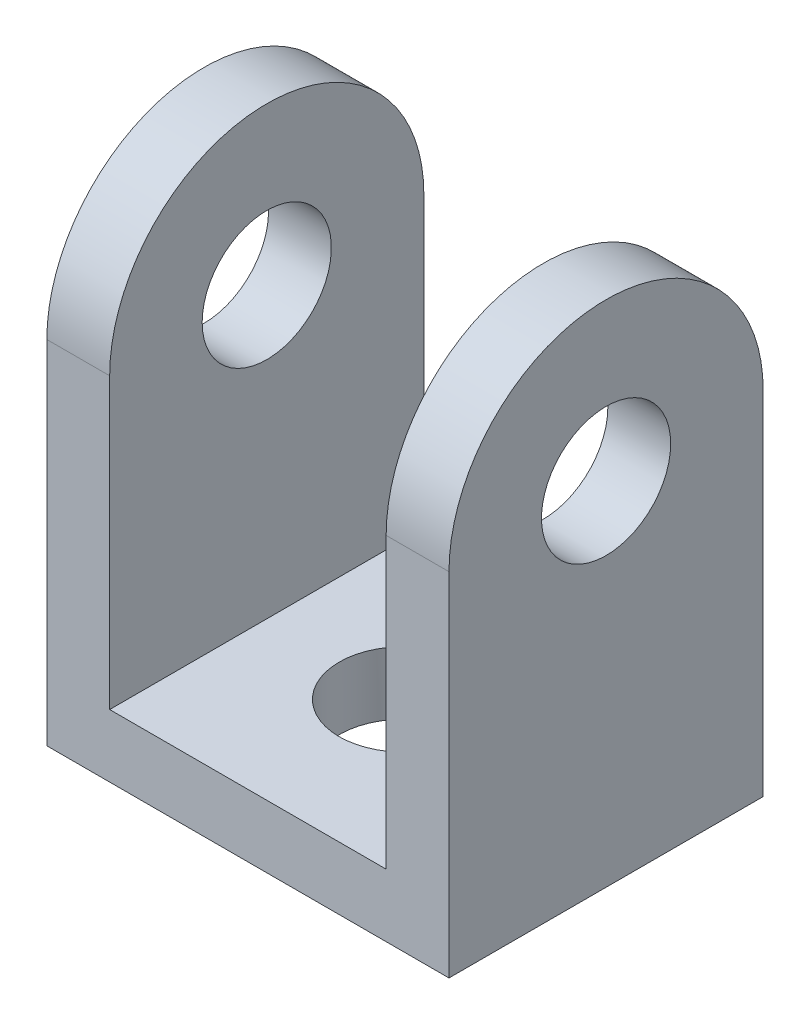
ISO-10303-21;
HEADER;
FILE_DESCRIPTION(('STEP AP214'),'2;1');
FILE_NAME('part.step','',(''),(''),'','','');
FILE_SCHEMA(('AUTOMOTIVE_DESIGN { 1 0 10303 214 1 1 1 1 }'));
ENDSEC;
DATA;
#1=APPLICATION_CONTEXT('core data for automotive mechanical design processes');
#2=APPLICATION_PROTOCOL_DEFINITION('international standard','automotive_design',2000,#1);
#3=PRODUCT_CONTEXT('',#1,'mechanical');
#4=PRODUCT('Part','Part','',(#3));
#5=PRODUCT_RELATED_PRODUCT_CATEGORY('part','',(#4));
#6=PRODUCT_DEFINITION_FORMATION('','',#4);
#7=PRODUCT_DEFINITION_CONTEXT('part definition',#1,'design');
#8=PRODUCT_DEFINITION('design','',#6,#7);
#9=PRODUCT_DEFINITION_SHAPE('','',#8);
#10=(LENGTH_UNIT() NAMED_UNIT(*) SI_UNIT(.MILLI.,.METRE.));
#11=(NAMED_UNIT(*) PLANE_ANGLE_UNIT() SI_UNIT($,.RADIAN.));
#12=(NAMED_UNIT(*) SI_UNIT($,.STERADIAN.) SOLID_ANGLE_UNIT());
#13=UNCERTAINTY_MEASURE_WITH_UNIT(LENGTH_MEASURE(1.E-05),#10,'distance_accuracy_value','');
#14=(GEOMETRIC_REPRESENTATION_CONTEXT(3) GLOBAL_UNCERTAINTY_ASSIGNED_CONTEXT((#13)) GLOBAL_UNIT_ASSIGNED_CONTEXT((#10,
#11,#12)) REPRESENTATION_CONTEXT('',''));
#15=CARTESIAN_POINT('',(0.,0.,0.));
#16=DIRECTION('',(0.,0.,1.));
#17=DIRECTION('',(1.,0.,0.));
#18=AXIS2_PLACEMENT_3D('',#15,#16,#17);
#19=CARTESIAN_POINT('',(20.32,0.,0.));
#20=DIRECTION('',(-1.,0.,0.));
#21=DIRECTION('',(0.,0.,1.));
#22=AXIS2_PLACEMENT_3D('',#19,#20,#21);
#23=CYLINDRICAL_SURFACE('',#22,7.9375);
#24=DIRECTION('',(-1.,0.,0.));
#25=VECTOR('',#24,1.);
#26=CARTESIAN_POINT('',(20.32,0.,-7.9375));
#27=LINE('',#26,#25);
#28=CARTESIAN_POINT('',(20.32,0.,-7.9375));
#29=VERTEX_POINT('',#28);
#30=CARTESIAN_POINT('',(17.145,0.,-7.9375));
#31=VERTEX_POINT('',#30);
#32=EDGE_CURVE('E52',#29,#31,#27,.T.);
#33=ORIENTED_EDGE('',*,*,#32,.T.);
#34=CARTESIAN_POINT('',(17.145,0.,0.));
#35=DIRECTION('',(1.,0.,0.));
#36=DIRECTION('',(0.,0.,-1.));
#37=AXIS2_PLACEMENT_3D('',#34,#35,#36);
#38=CIRCLE('',#37,7.9375);
#39=CARTESIAN_POINT('',(17.145,0.,7.9375));
#40=VERTEX_POINT('',#39);
#41=EDGE_CURVE('E149',#31,#40,#38,.T.);
#42=ORIENTED_EDGE('',*,*,#41,.T.);
#43=DIRECTION('',(-1.,0.,0.));
#44=VECTOR('',#43,1.);
#45=CARTESIAN_POINT('',(20.32,0.,7.9375));
#46=LINE('',#45,#44);
#47=CARTESIAN_POINT('',(20.32,0.,7.9375));
#48=VERTEX_POINT('',#47);
#49=EDGE_CURVE('E177',#48,#40,#46,.T.);
#50=ORIENTED_EDGE('',*,*,#49,.F.);
#51=CARTESIAN_POINT('',(20.32,0.,0.));
#52=DIRECTION('',(1.,0.,0.));
#53=DIRECTION('',(0.,0.,-1.));
#54=AXIS2_PLACEMENT_3D('',#51,#52,#53);
#55=CIRCLE('',#54,7.9375);
#56=EDGE_CURVE('E97',#29,#48,#55,.T.);
#57=ORIENTED_EDGE('',*,*,#56,.F.);
#58=EDGE_LOOP('',(#33,#42,#50,#57));
#59=FACE_BOUND('',#58,.T.);
#60=ADVANCED_FACE('F43',(#59),#23,.T.);
#61=CARTESIAN_POINT('',(20.32,0.,0.));
#62=DIRECTION('',(-1.,0.,0.));
#63=DIRECTION('',(0.,0.,1.));
#64=AXIS2_PLACEMENT_3D('',#61,#62,#63);
#65=CYLINDRICAL_SURFACE('',#64,3.2639);
#66=CARTESIAN_POINT('',(17.145,0.,0.));
#67=DIRECTION('',(1.,0.,0.));
#68=DIRECTION('',(0.,0.,-1.));
#69=AXIS2_PLACEMENT_3D('',#66,#67,#68);
#70=CIRCLE('',#69,3.2639);
#71=CARTESIAN_POINT('',(17.145,0.,-3.2639));
#72=VERTEX_POINT('',#71);
#73=EDGE_CURVE('E139',#72,#72,#70,.T.);
#74=ORIENTED_EDGE('',*,*,#73,.F.);
#75=EDGE_LOOP('',(#74));
#76=FACE_BOUND('',#75,.T.);
#77=CARTESIAN_POINT('',(20.32,0.,0.));
#78=DIRECTION('',(1.,0.,0.));
#79=DIRECTION('',(0.,0.,-1.));
#80=AXIS2_PLACEMENT_3D('',#77,#78,#79);
#81=CIRCLE('',#80,3.2639);
#82=CARTESIAN_POINT('',(20.32,0.,-3.2639));
#83=VERTEX_POINT('',#82);
#84=EDGE_CURVE('E160',#83,#83,#81,.T.);
#85=ORIENTED_EDGE('',*,*,#84,.T.);
#86=EDGE_LOOP('',(#85));
#87=FACE_BOUND('',#86,.T.);
#88=ADVANCED_FACE('F208',(#76,#87),#65,.F.);
#89=CARTESIAN_POINT('',(20.32,0.,-7.9375));
#90=DIRECTION('',(0.,0.,1.));
#91=DIRECTION('',(0.,-1.,0.));
#92=AXIS2_PLACEMENT_3D('',#89,#90,#91);
#93=PLANE('',#92);
#94=DIRECTION('',(1.,0.,0.));
#95=VECTOR('',#94,1.);
#96=CARTESIAN_POINT('',(20.32,-14.605,-7.9375));
#97=LINE('',#96,#95);
#98=CARTESIAN_POINT('',(3.175,-14.605,-7.9375));
#99=VERTEX_POINT('',#98);
#100=CARTESIAN_POINT('',(17.145,-14.605,-7.9375));
#101=VERTEX_POINT('',#100);
#102=EDGE_CURVE('E120',#99,#101,#97,.T.);
#103=ORIENTED_EDGE('',*,*,#102,.T.);
#104=DIRECTION('',(0.,1.,0.));
#105=VECTOR('',#104,1.);
#106=CARTESIAN_POINT('',(17.145,0.,-7.9375));
#107=LINE('',#106,#105);
#108=EDGE_CURVE('E130',#101,#31,#107,.T.);
#109=ORIENTED_EDGE('',*,*,#108,.T.);
#110=ORIENTED_EDGE('',*,*,#32,.F.);
#111=DIRECTION('',(0.,1.,0.));
#112=VECTOR('',#111,1.);
#113=CARTESIAN_POINT('',(20.32,0.,-7.9375));
#114=LINE('',#113,#112);
#115=CARTESIAN_POINT('',(20.32,-17.78,-7.9375));
#116=VERTEX_POINT('',#115);
#117=EDGE_CURVE('E153',#116,#29,#114,.T.);
#118=ORIENTED_EDGE('',*,*,#117,.F.);
#119=DIRECTION('',(-1.,0.,0.));
#120=VECTOR('',#119,1.);
#121=CARTESIAN_POINT('',(20.32,-17.78,-7.9375));
#122=LINE('',#121,#120);
#123=CARTESIAN_POINT('',(0.,-17.78,-7.9375));
#124=VERTEX_POINT('',#123);
#125=EDGE_CURVE('E163',#116,#124,#122,.T.);
#126=ORIENTED_EDGE('',*,*,#125,.T.);
#127=DIRECTION('',(0.,1.,0.));
#128=VECTOR('',#127,1.);
#129=CARTESIAN_POINT('',(0.,0.,-7.9375));
#130=LINE('',#129,#128);
#131=CARTESIAN_POINT('',(0.,0.,-7.9375));
#132=VERTEX_POINT('',#131);
#133=EDGE_CURVE('E129',#124,#132,#130,.T.);
#134=ORIENTED_EDGE('',*,*,#133,.T.);
#135=CARTESIAN_POINT('',(3.175,0.,-7.9375));
#136=VERTEX_POINT('',#135);
#137=EDGE_CURVE('E138',#136,#132,#27,.T.);
#138=ORIENTED_EDGE('',*,*,#137,.F.);
#139=DIRECTION('',(0.,-1.,0.));
#140=VECTOR('',#139,1.);
#141=CARTESIAN_POINT('',(3.175,0.,-7.9375));
#142=LINE('',#141,#140);
#143=EDGE_CURVE('E133',#136,#99,#142,.T.);
#144=ORIENTED_EDGE('',*,*,#143,.T.);
#145=EDGE_LOOP('',(#103,#109,#110,#118,#126,#134,#138,#144));
#146=FACE_BOUND('',#145,.T.);
#147=ADVANCED_FACE('F45',(#146),#93,.F.);
#148=CARTESIAN_POINT('',(3.175,0.,7.9375));
#149=VERTEX_POINT('',#148);
#150=CARTESIAN_POINT('',(0.,0.,7.9375));
#151=VERTEX_POINT('',#150);
#152=EDGE_CURVE('E176',#149,#151,#46,.T.);
#153=ORIENTED_EDGE('',*,*,#152,.F.);
#154=CARTESIAN_POINT('',(3.175,0.,0.));
#155=DIRECTION('',(-1.,0.,0.));
#156=DIRECTION('',(0.,0.,1.));
#157=AXIS2_PLACEMENT_3D('',#154,#155,#156);
#158=CIRCLE('',#157,7.9375);
#159=EDGE_CURVE('E59',#149,#136,#158,.T.);
#160=ORIENTED_EDGE('',*,*,#159,.T.);
#161=ORIENTED_EDGE('',*,*,#137,.T.);
#162=CARTESIAN_POINT('',(0.,0.,0.));
#163=DIRECTION('',(1.,0.,0.));
#164=DIRECTION('',(0.,0.,-1.));
#165=AXIS2_PLACEMENT_3D('',#162,#163,#164);
#166=CIRCLE('',#165,7.9375);
#167=EDGE_CURVE('E165',#132,#151,#166,.T.);
#168=ORIENTED_EDGE('',*,*,#167,.T.);
#169=EDGE_LOOP('',(#153,#160,#161,#168));
#170=FACE_BOUND('',#169,.T.);
#171=ADVANCED_FACE('F209',(#170),#23,.T.);
#172=CARTESIAN_POINT('',(20.32,0.,7.9375));
#173=DIRECTION('',(0.,0.,-1.));
#174=DIRECTION('',(0.,1.,0.));
#175=AXIS2_PLACEMENT_3D('',#172,#173,#174);
#176=PLANE('',#175);
#177=ORIENTED_EDGE('',*,*,#49,.T.);
#178=DIRECTION('',(0.,-1.,0.));
#179=VECTOR('',#178,1.);
#180=CARTESIAN_POINT('',(17.145,0.,7.9375));
#181=LINE('',#180,#179);
#182=CARTESIAN_POINT('',(17.145,-14.605,7.9375));
#183=VERTEX_POINT('',#182);
#184=EDGE_CURVE('E142',#40,#183,#181,.T.);
#185=ORIENTED_EDGE('',*,*,#184,.T.);
#186=DIRECTION('',(-1.,0.,0.));
#187=VECTOR('',#186,1.);
#188=CARTESIAN_POINT('',(20.32,-14.605,7.9375));
#189=LINE('',#188,#187);
#190=CARTESIAN_POINT('',(3.175,-14.605,7.9375));
#191=VERTEX_POINT('',#190);
#192=EDGE_CURVE('E11',#183,#191,#189,.T.);
#193=ORIENTED_EDGE('',*,*,#192,.T.);
#194=DIRECTION('',(0.,1.,0.));
#195=VECTOR('',#194,1.);
#196=CARTESIAN_POINT('',(3.175,0.,7.9375));
#197=LINE('',#196,#195);
#198=EDGE_CURVE('E134',#191,#149,#197,.T.);
#199=ORIENTED_EDGE('',*,*,#198,.T.);
#200=ORIENTED_EDGE('',*,*,#152,.T.);
#201=DIRECTION('',(0.,-1.,0.));
#202=VECTOR('',#201,1.);
#203=CARTESIAN_POINT('',(0.,0.,7.9375));
#204=LINE('',#203,#202);
#205=CARTESIAN_POINT('',(0.,-17.78,7.9375));
#206=VERTEX_POINT('',#205);
#207=EDGE_CURVE('E168',#151,#206,#204,.T.);
#208=ORIENTED_EDGE('',*,*,#207,.T.);
#209=DIRECTION('',(-1.,0.,0.));
#210=VECTOR('',#209,1.);
#211=CARTESIAN_POINT('',(20.32,-17.78,7.9375));
#212=LINE('',#211,#210);
#213=CARTESIAN_POINT('',(20.32,-17.78,7.9375));
#214=VERTEX_POINT('',#213);
#215=EDGE_CURVE('E174',#214,#206,#212,.T.);
#216=ORIENTED_EDGE('',*,*,#215,.F.);
#217=DIRECTION('',(0.,-1.,0.));
#218=VECTOR('',#217,1.);
#219=CARTESIAN_POINT('',(20.32,0.,7.9375));
#220=LINE('',#219,#218);
#221=EDGE_CURVE('E157',#48,#214,#220,.T.);
#222=ORIENTED_EDGE('',*,*,#221,.F.);
#223=EDGE_LOOP('',(#177,#185,#193,#199,#200,#208,#216,#222));
#224=FACE_BOUND('',#223,.T.);
#225=ADVANCED_FACE('F219',(#224),#176,.F.);
#226=CARTESIAN_POINT('',(20.32,-17.78,0.));
#227=DIRECTION('',(0.,1.,0.));
#228=DIRECTION('',(0.,0.,1.));
#229=AXIS2_PLACEMENT_3D('',#226,#227,#228);
#230=PLANE('',#229);
#231=CARTESIAN_POINT('',(10.16,-17.78,0.0634999999999993));
#232=DIRECTION('',(0.,1.,0.));
#233=DIRECTION('',(0.,0.,1.));
#234=AXIS2_PLACEMENT_3D('',#231,#232,#233);
#235=CIRCLE('',#234,3.2639);
#236=CARTESIAN_POINT('',(10.16,-17.78,3.3274));
#237=VERTEX_POINT('',#236);
#238=EDGE_CURVE('E188',#237,#237,#235,.T.);
#239=ORIENTED_EDGE('',*,*,#238,.T.);
#240=EDGE_LOOP('',(#239));
#241=FACE_BOUND('',#240,.T.);
#242=DIRECTION('',(0.,0.,-1.));
#243=VECTOR('',#242,1.);
#244=CARTESIAN_POINT('',(0.,-17.78,0.));
#245=LINE('',#244,#243);
#246=EDGE_CURVE('E89',#206,#124,#245,.T.);
#247=ORIENTED_EDGE('',*,*,#246,.T.);
#248=ORIENTED_EDGE('',*,*,#125,.F.);
#249=DIRECTION('',(0.,0.,-1.));
#250=VECTOR('',#249,1.);
#251=CARTESIAN_POINT('',(20.32,-17.78,0.));
#252=LINE('',#251,#250);
#253=EDGE_CURVE('E68',#214,#116,#252,.T.);
#254=ORIENTED_EDGE('',*,*,#253,.F.);
#255=ORIENTED_EDGE('',*,*,#215,.T.);
#256=EDGE_LOOP('',(#247,#248,#254,#255));
#257=FACE_BOUND('',#256,.T.);
#258=ADVANCED_FACE('F225',(#241,#257),#230,.F.);
#259=CARTESIAN_POINT('',(3.175,0.,0.));
#260=DIRECTION('',(-1.,0.,0.));
#261=DIRECTION('',(0.,0.,1.));
#262=AXIS2_PLACEMENT_3D('',#259,#260,#261);
#263=CIRCLE('',#262,3.2639);
#264=CARTESIAN_POINT('',(3.175,0.,3.2639));
#265=VERTEX_POINT('',#264);
#266=EDGE_CURVE('E181',#265,#265,#263,.T.);
#267=ORIENTED_EDGE('',*,*,#266,.F.);
#268=EDGE_LOOP('',(#267));
#269=FACE_BOUND('',#268,.T.);
#270=CARTESIAN_POINT('',(0.,0.,0.));
#271=DIRECTION('',(1.,0.,0.));
#272=DIRECTION('',(0.,0.,-1.));
#273=AXIS2_PLACEMENT_3D('',#270,#271,#272);
#274=CIRCLE('',#273,3.2639);
#275=CARTESIAN_POINT('',(0.,0.,-3.2639));
#276=VERTEX_POINT('',#275);
#277=EDGE_CURVE('E155',#276,#276,#274,.T.);
#278=ORIENTED_EDGE('',*,*,#277,.F.);
#279=EDGE_LOOP('',(#278));
#280=FACE_BOUND('',#279,.T.);
#281=ADVANCED_FACE('F216',(#269,#280),#65,.F.);
#282=CARTESIAN_POINT('',(20.32,0.,0.));
#283=DIRECTION('',(1.,0.,0.));
#284=DIRECTION('',(0.,0.,-1.));
#285=AXIS2_PLACEMENT_3D('',#282,#283,#284);
#286=PLANE('',#285);
#287=ORIENTED_EDGE('',*,*,#117,.T.);
#288=ORIENTED_EDGE('',*,*,#56,.T.);
#289=ORIENTED_EDGE('',*,*,#221,.T.);
#290=ORIENTED_EDGE('',*,*,#253,.T.);
#291=EDGE_LOOP('',(#287,#288,#289,#290));
#292=FACE_BOUND('',#291,.T.);
#293=ORIENTED_EDGE('',*,*,#84,.F.);
#294=EDGE_LOOP('',(#293));
#295=FACE_BOUND('',#294,.T.);
#296=ADVANCED_FACE('F235',(#292,#295),#286,.T.);
#297=CARTESIAN_POINT('',(0.,0.,0.));
#298=DIRECTION('',(1.,0.,0.));
#299=DIRECTION('',(0.,0.,-1.));
#300=AXIS2_PLACEMENT_3D('',#297,#298,#299);
#301=PLANE('',#300);
#302=ORIENTED_EDGE('',*,*,#133,.F.);
#303=ORIENTED_EDGE('',*,*,#246,.F.);
#304=ORIENTED_EDGE('',*,*,#207,.F.);
#305=ORIENTED_EDGE('',*,*,#167,.F.);
#306=EDGE_LOOP('',(#302,#303,#304,#305));
#307=FACE_BOUND('',#306,.T.);
#308=ORIENTED_EDGE('',*,*,#277,.T.);
#309=EDGE_LOOP('',(#308));
#310=FACE_BOUND('',#309,.T.);
#311=ADVANCED_FACE('F244',(#307,#310),#301,.F.);
#312=CARTESIAN_POINT('',(3.175,-14.605,-12.7));
#313=DIRECTION('',(0.,-1.,0.));
#314=DIRECTION('',(0.,0.,-1.));
#315=AXIS2_PLACEMENT_3D('',#312,#313,#314);
#316=PLANE('',#315);
#317=CARTESIAN_POINT('',(10.16,-14.605,0.0634999999999993));
#318=DIRECTION('',(0.,-1.,0.));
#319=DIRECTION('',(0.,0.,-1.));
#320=AXIS2_PLACEMENT_3D('',#317,#318,#319);
#321=CIRCLE('',#320,3.2639);
#322=CARTESIAN_POINT('',(10.16,-14.605,-3.2004));
#323=VERTEX_POINT('',#322);
#324=EDGE_CURVE('E47',#323,#323,#321,.T.);
#325=ORIENTED_EDGE('',*,*,#324,.T.);
#326=EDGE_LOOP('',(#325));
#327=FACE_BOUND('',#326,.T.);
#328=DIRECTION('',(0.,0.,1.));
#329=VECTOR('',#328,1.);
#330=CARTESIAN_POINT('',(3.175,-14.605,-12.7));
#331=LINE('',#330,#329);
#332=EDGE_CURVE('E123',#99,#191,#331,.T.);
#333=ORIENTED_EDGE('',*,*,#332,.T.);
#334=ORIENTED_EDGE('',*,*,#192,.F.);
#335=DIRECTION('',(0.,0.,1.));
#336=VECTOR('',#335,1.);
#337=CARTESIAN_POINT('',(17.145,-14.605,-12.7));
#338=LINE('',#337,#336);
#339=EDGE_CURVE('E125',#101,#183,#338,.T.);
#340=ORIENTED_EDGE('',*,*,#339,.F.);
#341=ORIENTED_EDGE('',*,*,#102,.F.);
#342=EDGE_LOOP('',(#333,#334,#340,#341));
#343=FACE_BOUND('',#342,.T.);
#344=ADVANCED_FACE('F122',(#327,#343),#316,.F.);
#345=CARTESIAN_POINT('',(17.145,-14.605,-12.7));
#346=DIRECTION('',(1.,0.,0.));
#347=DIRECTION('',(0.,0.,-1.));
#348=AXIS2_PLACEMENT_3D('',#345,#346,#347);
#349=PLANE('',#348);
#350=ORIENTED_EDGE('',*,*,#73,.T.);
#351=EDGE_LOOP('',(#350));
#352=FACE_BOUND('',#351,.T.);
#353=ORIENTED_EDGE('',*,*,#339,.T.);
#354=ORIENTED_EDGE('',*,*,#184,.F.);
#355=ORIENTED_EDGE('',*,*,#41,.F.);
#356=ORIENTED_EDGE('',*,*,#108,.F.);
#357=EDGE_LOOP('',(#353,#354,#355,#356));
#358=FACE_BOUND('',#357,.T.);
#359=ADVANCED_FACE('F204',(#352,#358),#349,.F.);
#360=CARTESIAN_POINT('',(3.175,-14.605,-12.7));
#361=DIRECTION('',(-1.,0.,0.));
#362=DIRECTION('',(0.,0.,1.));
#363=AXIS2_PLACEMENT_3D('',#360,#361,#362);
#364=PLANE('',#363);
#365=ORIENTED_EDGE('',*,*,#266,.T.);
#366=EDGE_LOOP('',(#365));
#367=FACE_BOUND('',#366,.T.);
#368=ORIENTED_EDGE('',*,*,#159,.F.);
#369=ORIENTED_EDGE('',*,*,#198,.F.);
#370=ORIENTED_EDGE('',*,*,#332,.F.);
#371=ORIENTED_EDGE('',*,*,#143,.F.);
#372=EDGE_LOOP('',(#368,#369,#370,#371));
#373=FACE_BOUND('',#372,.T.);
#374=ADVANCED_FACE('F132',(#367,#373),#364,.F.);
#375=CARTESIAN_POINT('',(10.16,-17.78,0.0634999999999993));
#376=DIRECTION('',(0.,1.,0.));
#377=DIRECTION('',(0.,0.,1.));
#378=AXIS2_PLACEMENT_3D('',#375,#376,#377);
#379=CYLINDRICAL_SURFACE('',#378,3.2639);
#380=ORIENTED_EDGE('',*,*,#238,.F.);
#381=EDGE_LOOP('',(#380));
#382=FACE_BOUND('',#381,.T.);
#383=ORIENTED_EDGE('',*,*,#324,.F.);
#384=EDGE_LOOP('',(#383));
#385=FACE_BOUND('',#384,.T.);
#386=ADVANCED_FACE('F196',(#382,#385),#379,.F.);
#387=CLOSED_SHELL('',(#60,#88,#147,#171,#225,#258,#281,#296,#311,#344,#359,#374,#386));
#388=MANIFOLD_SOLID_BREP('B2',#387);
#389=ADVANCED_BREP_SHAPE_REPRESENTATION('',(#18,#388),#14);
#390=SHAPE_DEFINITION_REPRESENTATION(#9,#389);
ENDSEC;
END-ISO-10303-21;
